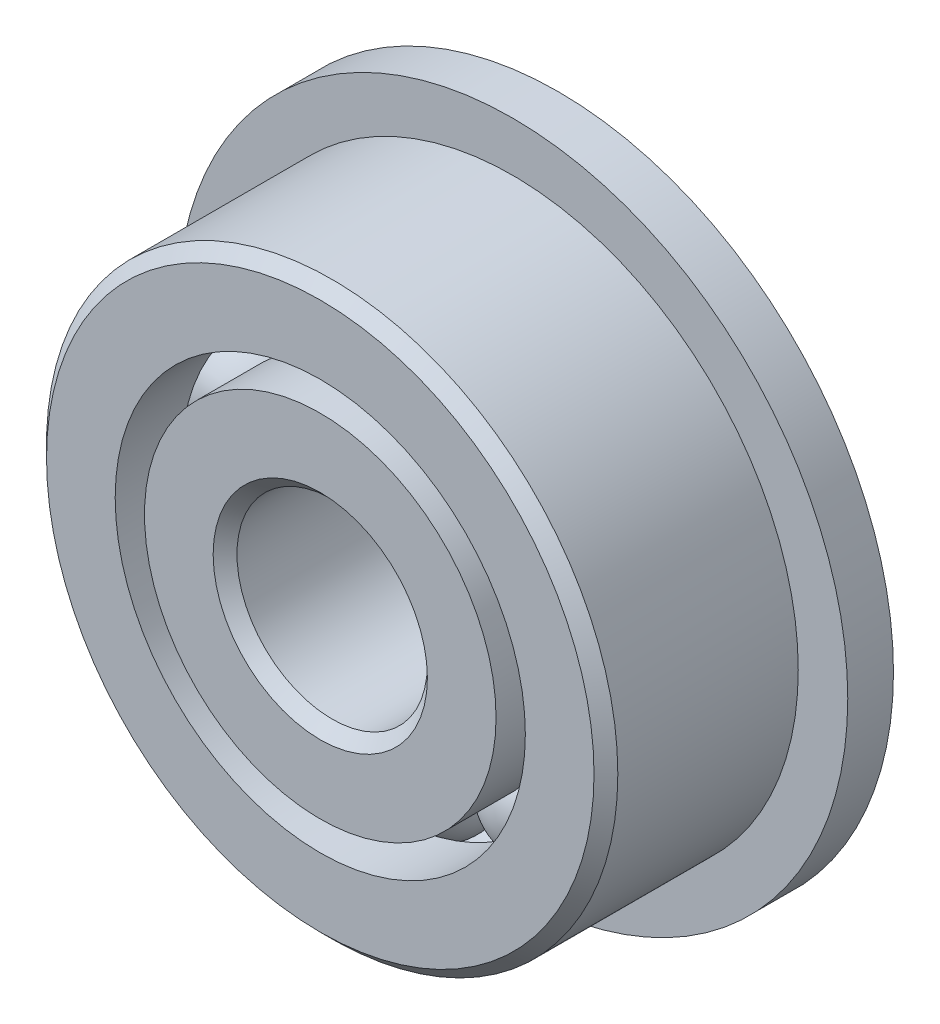
ISO-10303-21;
HEADER;
FILE_DESCRIPTION(('STEP AP214'),'2;1');
FILE_NAME('part.step','',(''),(''),'','','');
FILE_SCHEMA(('AUTOMOTIVE_DESIGN { 1 0 10303 214 1 1 1 1 }'));
ENDSEC;
DATA;
#1=APPLICATION_CONTEXT('core data for automotive mechanical design processes');
#2=APPLICATION_PROTOCOL_DEFINITION('international standard','automotive_design',2000,#1);
#3=PRODUCT_CONTEXT('',#1,'mechanical');
#4=PRODUCT('Part','Part','',(#3));
#5=PRODUCT_RELATED_PRODUCT_CATEGORY('part','',(#4));
#6=PRODUCT_DEFINITION_FORMATION('','',#4);
#7=PRODUCT_DEFINITION_CONTEXT('part definition',#1,'design');
#8=PRODUCT_DEFINITION('design','',#6,#7);
#9=PRODUCT_DEFINITION_SHAPE('','',#8);
#10=(LENGTH_UNIT() NAMED_UNIT(*) SI_UNIT(.MILLI.,.METRE.));
#11=(NAMED_UNIT(*) PLANE_ANGLE_UNIT() SI_UNIT($,.RADIAN.));
#12=(NAMED_UNIT(*) SI_UNIT($,.STERADIAN.) SOLID_ANGLE_UNIT());
#13=UNCERTAINTY_MEASURE_WITH_UNIT(LENGTH_MEASURE(1.E-05),#10,'distance_accuracy_value','');
#14=(GEOMETRIC_REPRESENTATION_CONTEXT(3) GLOBAL_UNCERTAINTY_ASSIGNED_CONTEXT((#13)) GLOBAL_UNIT_ASSIGNED_CONTEXT((#10,
#11,#12)) REPRESENTATION_CONTEXT('',''));
#15=CARTESIAN_POINT('',(0.,0.,0.));
#16=DIRECTION('',(0.,0.,1.));
#17=DIRECTION('',(1.,0.,0.));
#18=AXIS2_PLACEMENT_3D('',#15,#16,#17);
#19=CARTESIAN_POINT('',(-1.86621817602857,2.56862895714048,0.));
#20=DIRECTION('',(0.,0.,1.));
#21=DIRECTION('',(-0.587785252292462,0.809016994374955,0.));
#22=AXIS2_PLACEMENT_3D('',#19,#20,#21);
#23=SPHERICAL_SURFACE('',#22,0.915136422466876);
#24=CARTESIAN_POINT('',(-1.86621817602857,2.56862895714048,0.915136422466876));
#25=VERTEX_POINT('',#24);
#26=VERTEX_LOOP('',#25);
#27=FACE_BOUND('',#26,.T.);
#28=ADVANCED_FACE('F37',(#27),#23,.T.);
#29=CLOSED_SHELL('',(#28));
#30=MANIFOLD_SOLID_BREP('B2',#29);
#31=CARTESIAN_POINT('',(-3.0196044392371,0.981128957140492,0.));
#32=DIRECTION('',(0.,0.,1.));
#33=DIRECTION('',(-0.95105651629515,0.309016994374958,0.));
#34=AXIS2_PLACEMENT_3D('',#31,#32,#33);
#35=SPHERICAL_SURFACE('',#34,0.915136422466876);
#36=CARTESIAN_POINT('',(-3.0196044392371,0.981128957140492,0.915136422466876));
#37=VERTEX_POINT('',#36);
#38=VERTEX_LOOP('',#37);
#39=FACE_BOUND('',#38,.T.);
#40=ADVANCED_FACE('F57',(#39),#35,.T.);
#41=CLOSED_SHELL('',(#40));
#42=MANIFOLD_SOLID_BREP('B6',#41);
#43=CARTESIAN_POINT('',(-3.01960443923712,-0.981128957140429,0.));
#44=DIRECTION('',(0.,0.,1.));
#45=DIRECTION('',(-0.951056516295157,-0.309016994374938,0.));
#46=AXIS2_PLACEMENT_3D('',#43,#44,#45);
#47=SPHERICAL_SURFACE('',#46,0.915136422466876);
#48=CARTESIAN_POINT('',(-3.01960443923712,-0.981128957140429,0.915136422466876));
#49=VERTEX_POINT('',#48);
#50=VERTEX_LOOP('',#49);
#51=FACE_BOUND('',#50,.T.);
#52=ADVANCED_FACE('F77',(#51),#47,.T.);
#53=CLOSED_SHELL('',(#52));
#54=MANIFOLD_SOLID_BREP('B33',#53);
#55=CARTESIAN_POINT('',(-1.86621817602862,-2.56862895714044,0.));
#56=DIRECTION('',(0.,0.,1.));
#57=DIRECTION('',(-0.58778525229248,-0.809016994374942,0.));
#58=AXIS2_PLACEMENT_3D('',#55,#56,#57);
#59=SPHERICAL_SURFACE('',#58,0.915136422466876);
#60=CARTESIAN_POINT('',(-1.86621817602862,-2.56862895714044,0.915136422466876));
#61=VERTEX_POINT('',#60);
#62=VERTEX_LOOP('',#61);
#63=FACE_BOUND('',#62,.T.);
#64=ADVANCED_FACE('F97',(#63),#59,.T.);
#65=CLOSED_SHELL('',(#64));
#66=MANIFOLD_SOLID_BREP('B53',#65);
#67=CARTESIAN_POINT('',(0.,-3.175,0.));
#68=DIRECTION('',(0.,0.,1.));
#69=DIRECTION('',(0.,-1.,0.));
#70=AXIS2_PLACEMENT_3D('',#67,#68,#69);
#71=SPHERICAL_SURFACE('',#70,0.915136422466876);
#72=CARTESIAN_POINT('',(0.,-3.175,0.915136422466876));
#73=VERTEX_POINT('',#72);
#74=VERTEX_LOOP('',#73);
#75=FACE_BOUND('',#74,.T.);
#76=ADVANCED_FACE('F117',(#75),#71,.T.);
#77=CLOSED_SHELL('',(#76));
#78=MANIFOLD_SOLID_BREP('B73',#77);
#79=CARTESIAN_POINT('',(1.86621817602859,-2.56862895714047,0.));
#80=DIRECTION('',(0.,0.,1.));
#81=DIRECTION('',(0.587785252292469,-0.809016994374951,0.));
#82=AXIS2_PLACEMENT_3D('',#79,#80,#81);
#83=SPHERICAL_SURFACE('',#82,0.915136422466876);
#84=CARTESIAN_POINT('',(1.86621817602859,-2.56862895714047,0.915136422466876));
#85=VERTEX_POINT('',#84);
#86=VERTEX_LOOP('',#85);
#87=FACE_BOUND('',#86,.T.);
#88=ADVANCED_FACE('F137',(#87),#83,.T.);
#89=CLOSED_SHELL('',(#88));
#90=MANIFOLD_SOLID_BREP('B93',#89);
#91=CARTESIAN_POINT('',(3.01960443923711,-0.981128957140471,0.));
#92=DIRECTION('',(0.,0.,1.));
#93=DIRECTION('',(0.951056516295152,-0.309016994374952,0.));
#94=AXIS2_PLACEMENT_3D('',#91,#92,#93);
#95=SPHERICAL_SURFACE('',#94,0.915136422466876);
#96=CARTESIAN_POINT('',(3.01960443923711,-0.981128957140471,0.915136422466876));
#97=VERTEX_POINT('',#96);
#98=VERTEX_LOOP('',#97);
#99=FACE_BOUND('',#98,.T.);
#100=ADVANCED_FACE('F157',(#99),#95,.T.);
#101=CLOSED_SHELL('',(#100));
#102=MANIFOLD_SOLID_BREP('B113',#101);
#103=CARTESIAN_POINT('',(3.01960443923712,0.98112895714045,0.));
#104=DIRECTION('',(0.,0.,1.));
#105=DIRECTION('',(0.951056516295155,0.309016994374945,0.));
#106=AXIS2_PLACEMENT_3D('',#103,#104,#105);
#107=SPHERICAL_SURFACE('',#106,0.915136422466876);
#108=CARTESIAN_POINT('',(3.01960443923712,0.98112895714045,0.915136422466876));
#109=VERTEX_POINT('',#108);
#110=VERTEX_LOOP('',#109);
#111=FACE_BOUND('',#110,.T.);
#112=ADVANCED_FACE('F177',(#111),#107,.T.);
#113=CLOSED_SHELL('',(#112));
#114=MANIFOLD_SOLID_BREP('B133',#113);
#115=CARTESIAN_POINT('',(1.86621817602861,2.56862895714046,0.));
#116=DIRECTION('',(0.,0.,1.));
#117=DIRECTION('',(0.587785252292474,0.809016994374947,0.));
#118=AXIS2_PLACEMENT_3D('',#115,#116,#117);
#119=SPHERICAL_SURFACE('',#118,0.915136422466876);
#120=CARTESIAN_POINT('',(1.86621817602861,2.56862895714046,0.915136422466876));
#121=VERTEX_POINT('',#120);
#122=VERTEX_LOOP('',#121);
#123=FACE_BOUND('',#122,.T.);
#124=ADVANCED_FACE('F197',(#123),#119,.T.);
#125=CLOSED_SHELL('',(#124));
#126=MANIFOLD_SOLID_BREP('B153',#125);
#127=CARTESIAN_POINT('',(0.,3.175,0.));
#128=DIRECTION('',(0.,0.,1.));
#129=DIRECTION('',(0.,1.,0.));
#130=AXIS2_PLACEMENT_3D('',#127,#128,#129);
#131=SPHERICAL_SURFACE('',#130,0.915136422466876);
#132=CARTESIAN_POINT('',(0.,3.175,0.915136422466876));
#133=VERTEX_POINT('',#132);
#134=VERTEX_LOOP('',#133);
#135=FACE_BOUND('',#134,.T.);
#136=ADVANCED_FACE('F219',(#135),#131,.T.);
#137=CLOSED_SHELL('',(#136));
#138=MANIFOLD_SOLID_BREP('B173',#137);
#139=CARTESIAN_POINT('',(0.,2.93076923076923,1.984375));
#140=DIRECTION('',(0.,0.,-1.));
#141=DIRECTION('',(-1.,0.,0.));
#142=AXIS2_PLACEMENT_3D('',#139,#140,#141);
#143=PLANE('',#142);
#144=CARTESIAN_POINT('',(0.,0.,1.984375));
#145=DIRECTION('',(0.,0.,1.));
#146=DIRECTION('',(1.,0.,0.));
#147=AXIS2_PLACEMENT_3D('',#144,#145,#146);
#148=CIRCLE('',#147,1.7859375);
#149=CARTESIAN_POINT('',(1.7859375,0.,1.984375));
#150=VERTEX_POINT('',#149);
#151=EDGE_CURVE('E266',#150,#150,#148,.T.);
#152=ORIENTED_EDGE('',*,*,#151,.F.);
#153=EDGE_LOOP('',(#152));
#154=FACE_BOUND('',#153,.T.);
#155=CARTESIAN_POINT('',(0.,0.,1.984375));
#156=DIRECTION('',(0.,0.,1.));
#157=DIRECTION('',(1.,0.,0.));
#158=AXIS2_PLACEMENT_3D('',#155,#156,#157);
#159=CIRCLE('',#158,2.93076923076923);
#160=CARTESIAN_POINT('',(2.93076923076923,0.,1.984375));
#161=VERTEX_POINT('',#160);
#162=EDGE_CURVE('E218',#161,#161,#159,.T.);
#163=ORIENTED_EDGE('',*,*,#162,.T.);
#164=EDGE_LOOP('',(#163));
#165=FACE_BOUND('',#164,.T.);
#166=ADVANCED_FACE('F238',(#154,#165),#143,.F.);
#167=CARTESIAN_POINT('',(0.,0.,1.984375));
#168=DIRECTION('',(0.,0.,1.));
#169=DIRECTION('',(1.,0.,0.));
#170=AXIS2_PLACEMENT_3D('',#167,#168,#169);
#171=CYLINDRICAL_SURFACE('',#170,2.93076923076923);
#172=ORIENTED_EDGE('',*,*,#162,.F.);
#173=EDGE_LOOP('',(#172));
#174=FACE_BOUND('',#173,.T.);
#175=CARTESIAN_POINT('',(0.,0.,0.881944444444444));
#176=DIRECTION('',(0.,0.,1.));
#177=DIRECTION('',(1.,0.,0.));
#178=AXIS2_PLACEMENT_3D('',#175,#176,#177);
#179=CIRCLE('',#178,2.93076923076923);
#180=CARTESIAN_POINT('',(2.93076923076923,0.,0.881944444444444));
#181=VERTEX_POINT('',#180);
#182=EDGE_CURVE('E244',#181,#181,#179,.T.);
#183=ORIENTED_EDGE('',*,*,#182,.T.);
#184=EDGE_LOOP('',(#183));
#185=FACE_BOUND('',#184,.T.);
#186=ADVANCED_FACE('F273',(#174,#185),#171,.T.);
#187=CARTESIAN_POINT('',(0.,0.,0.));
#188=DIRECTION('',(0.,0.,1.));
#189=DIRECTION('',(1.,0.,0.));
#190=AXIS2_PLACEMENT_3D('',#187,#188,#189);
#191=TOROIDAL_SURFACE('',#190,3.175,0.915136422466875);
#192=ORIENTED_EDGE('',*,*,#182,.F.);
#193=EDGE_LOOP('',(#192));
#194=FACE_BOUND('',#193,.T.);
#195=CARTESIAN_POINT('',(0.,0.,-0.881944444444445));
#196=DIRECTION('',(0.,0.,1.));
#197=DIRECTION('',(1.,0.,0.));
#198=AXIS2_PLACEMENT_3D('',#195,#196,#197);
#199=CIRCLE('',#198,2.93076923076923);
#200=CARTESIAN_POINT('',(2.93076923076923,0.,-0.881944444444445));
#201=VERTEX_POINT('',#200);
#202=EDGE_CURVE('E248',#201,#201,#199,.T.);
#203=ORIENTED_EDGE('',*,*,#202,.T.);
#204=EDGE_LOOP('',(#203));
#205=FACE_BOUND('',#204,.T.);
#206=ADVANCED_FACE('F277',(#194,#205),#191,.F.);
#207=CARTESIAN_POINT('',(0.,0.,1.984375));
#208=DIRECTION('',(0.,0.,1.));
#209=DIRECTION('',(1.,0.,0.));
#210=AXIS2_PLACEMENT_3D('',#207,#208,#209);
#211=CYLINDRICAL_SURFACE('',#210,2.93076923076923);
#212=ORIENTED_EDGE('',*,*,#202,.F.);
#213=EDGE_LOOP('',(#212));
#214=FACE_BOUND('',#213,.T.);
#215=CARTESIAN_POINT('',(0.,0.,-1.984375));
#216=DIRECTION('',(0.,0.,1.));
#217=DIRECTION('',(1.,0.,0.));
#218=AXIS2_PLACEMENT_3D('',#215,#216,#217);
#219=CIRCLE('',#218,2.93076923076923);
#220=CARTESIAN_POINT('',(2.93076923076923,0.,-1.984375));
#221=VERTEX_POINT('',#220);
#222=EDGE_CURVE('E252',#221,#221,#219,.T.);
#223=ORIENTED_EDGE('',*,*,#222,.T.);
#224=EDGE_LOOP('',(#223));
#225=FACE_BOUND('',#224,.T.);
#226=ADVANCED_FACE('F282',(#214,#225),#211,.T.);
#227=CARTESIAN_POINT('',(0.,1.7859375,-1.984375));
#228=DIRECTION('',(0.,0.,1.));
#229=DIRECTION('',(1.,0.,0.));
#230=AXIS2_PLACEMENT_3D('',#227,#228,#229);
#231=PLANE('',#230);
#232=ORIENTED_EDGE('',*,*,#222,.F.);
#233=EDGE_LOOP('',(#232));
#234=FACE_BOUND('',#233,.T.);
#235=CARTESIAN_POINT('',(0.,0.,-1.984375));
#236=DIRECTION('',(0.,0.,1.));
#237=DIRECTION('',(1.,0.,0.));
#238=AXIS2_PLACEMENT_3D('',#235,#236,#237);
#239=CIRCLE('',#238,1.7859375);
#240=CARTESIAN_POINT('',(1.7859375,0.,-1.984375));
#241=VERTEX_POINT('',#240);
#242=EDGE_CURVE('E257',#241,#241,#239,.T.);
#243=ORIENTED_EDGE('',*,*,#242,.T.);
#244=EDGE_LOOP('',(#243));
#245=FACE_BOUND('',#244,.T.);
#246=ADVANCED_FACE('F288',(#234,#245),#231,.F.);
#247=CARTESIAN_POINT('',(0.,0.,-1.7859375));
#248=DIRECTION('',(0.,0.,-1.));
#249=DIRECTION('',(-1.,0.,0.));
#250=AXIS2_PLACEMENT_3D('',#247,#248,#249);
#251=CONICAL_SURFACE('',#250,1.5875,0.785398163397447);
#252=ORIENTED_EDGE('',*,*,#242,.F.);
#253=EDGE_LOOP('',(#252));
#254=FACE_BOUND('',#253,.T.);
#255=CARTESIAN_POINT('',(0.,0.,-1.7859375));
#256=DIRECTION('',(0.,0.,1.));
#257=DIRECTION('',(1.,0.,0.));
#258=AXIS2_PLACEMENT_3D('',#255,#256,#257);
#259=CIRCLE('',#258,1.5875);
#260=CARTESIAN_POINT('',(1.5875,0.,-1.7859375));
#261=VERTEX_POINT('',#260);
#262=EDGE_CURVE('E260',#261,#261,#259,.T.);
#263=ORIENTED_EDGE('',*,*,#262,.T.);
#264=EDGE_LOOP('',(#263));
#265=FACE_BOUND('',#264,.T.);
#266=ADVANCED_FACE('F292',(#254,#265),#251,.F.);
#267=CARTESIAN_POINT('',(0.,0.,1.984375));
#268=DIRECTION('',(0.,0.,1.));
#269=DIRECTION('',(1.,0.,0.));
#270=AXIS2_PLACEMENT_3D('',#267,#268,#269);
#271=CYLINDRICAL_SURFACE('',#270,1.5875);
#272=ORIENTED_EDGE('',*,*,#262,.F.);
#273=EDGE_LOOP('',(#272));
#274=FACE_BOUND('',#273,.T.);
#275=CARTESIAN_POINT('',(0.,0.,1.7859375));
#276=DIRECTION('',(0.,0.,1.));
#277=DIRECTION('',(1.,0.,0.));
#278=AXIS2_PLACEMENT_3D('',#275,#276,#277);
#279=CIRCLE('',#278,1.5875);
#280=CARTESIAN_POINT('',(1.5875,0.,1.7859375));
#281=VERTEX_POINT('',#280);
#282=EDGE_CURVE('E263',#281,#281,#279,.T.);
#283=ORIENTED_EDGE('',*,*,#282,.T.);
#284=EDGE_LOOP('',(#283));
#285=FACE_BOUND('',#284,.T.);
#286=ADVANCED_FACE('F296',(#274,#285),#271,.F.);
#287=CARTESIAN_POINT('',(0.,0.,1.984375));
#288=DIRECTION('',(0.,0.,1.));
#289=DIRECTION('',(1.,0.,0.));
#290=AXIS2_PLACEMENT_3D('',#287,#288,#289);
#291=CONICAL_SURFACE('',#290,1.7859375,0.785398163397449);
#292=ORIENTED_EDGE('',*,*,#282,.F.);
#293=EDGE_LOOP('',(#292));
#294=FACE_BOUND('',#293,.T.);
#295=ORIENTED_EDGE('',*,*,#151,.T.);
#296=EDGE_LOOP('',(#295));
#297=FACE_BOUND('',#296,.T.);
#298=ADVANCED_FACE('F270',(#294,#297),#291,.F.);
#299=CLOSED_SHELL('',(#166,#186,#206,#226,#246,#266,#286,#298));
#300=MANIFOLD_SOLID_BREP('B193',#299);
#301=CARTESIAN_POINT('',(0.,0.,1.7859375));
#302=DIRECTION('',(0.,0.,-1.));
#303=DIRECTION('',(-1.,0.,0.));
#304=AXIS2_PLACEMENT_3D('',#301,#302,#303);
#305=CONICAL_SURFACE('',#304,4.7625,0.785398163397448);
#306=CARTESIAN_POINT('',(0.,0.,1.984375));
#307=DIRECTION('',(0.,0.,1.));
#308=DIRECTION('',(1.,0.,0.));
#309=AXIS2_PLACEMENT_3D('',#306,#307,#308);
#310=CIRCLE('',#309,4.5640625);
#311=CARTESIAN_POINT('',(4.5640625,0.,1.984375));
#312=VERTEX_POINT('',#311);
#313=EDGE_CURVE('E381',#312,#312,#310,.T.);
#314=ORIENTED_EDGE('',*,*,#313,.F.);
#315=EDGE_LOOP('',(#314));
#316=FACE_BOUND('',#315,.T.);
#317=CARTESIAN_POINT('',(0.,0.,1.7859375));
#318=DIRECTION('',(0.,0.,1.));
#319=DIRECTION('',(1.,0.,0.));
#320=AXIS2_PLACEMENT_3D('',#317,#318,#319);
#321=CIRCLE('',#320,4.7625);
#322=CARTESIAN_POINT('',(4.7625,0.,1.7859375));
#323=VERTEX_POINT('',#322);
#324=EDGE_CURVE('E237',#323,#323,#321,.T.);
#325=ORIENTED_EDGE('',*,*,#324,.T.);
#326=EDGE_LOOP('',(#325));
#327=FACE_BOUND('',#326,.T.);
#328=ADVANCED_FACE('F359',(#316,#327),#305,.T.);
#329=CARTESIAN_POINT('',(0.,0.,1.984375));
#330=DIRECTION('',(0.,0.,1.));
#331=DIRECTION('',(1.,0.,0.));
#332=AXIS2_PLACEMENT_3D('',#329,#330,#331);
#333=CYLINDRICAL_SURFACE('',#332,4.7625);
#334=CARTESIAN_POINT('',(0.,0.,-1.222375));
#335=DIRECTION('',(0.,0.,1.));
#336=DIRECTION('',(1.,0.,0.));
#337=AXIS2_PLACEMENT_3D('',#334,#335,#336);
#338=CIRCLE('',#337,4.7625);
#339=CARTESIAN_POINT('',(4.7625,0.,-1.222375));
#340=VERTEX_POINT('',#339);
#341=EDGE_CURVE('E384',#340,#340,#338,.T.);
#342=ORIENTED_EDGE('',*,*,#341,.T.);
#343=EDGE_LOOP('',(#342));
#344=FACE_BOUND('',#343,.T.);
#345=ORIENTED_EDGE('',*,*,#324,.F.);
#346=EDGE_LOOP('',(#345));
#347=FACE_BOUND('',#346,.T.);
#348=ADVANCED_FACE('F404',(#344,#347),#333,.T.);
#349=CARTESIAN_POINT('',(0.,4.5640625,-1.984375));
#350=DIRECTION('',(0.,0.,1.));
#351=DIRECTION('',(1.,0.,0.));
#352=AXIS2_PLACEMENT_3D('',#349,#350,#351);
#353=PLANE('',#352);
#354=CARTESIAN_POINT('',(0.,0.,-1.984375));
#355=DIRECTION('',(0.,0.,1.));
#356=DIRECTION('',(1.,0.,0.));
#357=AXIS2_PLACEMENT_3D('',#354,#355,#356);
#358=CIRCLE('',#357,3.41923076923077);
#359=CARTESIAN_POINT('',(3.41923076923077,0.,-1.984375));
#360=VERTEX_POINT('',#359);
#361=EDGE_CURVE('E365',#360,#360,#358,.T.);
#362=ORIENTED_EDGE('',*,*,#361,.T.);
#363=EDGE_LOOP('',(#362));
#364=FACE_BOUND('',#363,.T.);
#365=CARTESIAN_POINT('',(0.,0.,-1.984375));
#366=DIRECTION('',(0.,0.,-1.));
#367=DIRECTION('',(-1.,0.,0.));
#368=AXIS2_PLACEMENT_3D('',#365,#366,#367);
#369=CIRCLE('',#368,5.588);
#370=CARTESIAN_POINT('',(-5.588,0.,-1.984375));
#371=VERTEX_POINT('',#370);
#372=EDGE_CURVE('E387',#371,#371,#369,.T.);
#373=ORIENTED_EDGE('',*,*,#372,.T.);
#374=EDGE_LOOP('',(#373));
#375=FACE_BOUND('',#374,.T.);
#376=ADVANCED_FACE('F407',(#364,#375),#353,.F.);
#377=CARTESIAN_POINT('',(0.,0.,1.984375));
#378=DIRECTION('',(0.,0.,1.));
#379=DIRECTION('',(1.,0.,0.));
#380=AXIS2_PLACEMENT_3D('',#377,#378,#379);
#381=CYLINDRICAL_SURFACE('',#380,3.41923076923077);
#382=CARTESIAN_POINT('',(0.,0.,-0.881944444444445));
#383=DIRECTION('',(0.,0.,1.));
#384=DIRECTION('',(1.,0.,0.));
#385=AXIS2_PLACEMENT_3D('',#382,#383,#384);
#386=CIRCLE('',#385,3.41923076923077);
#387=CARTESIAN_POINT('',(3.41923076923077,0.,-0.881944444444445));
#388=VERTEX_POINT('',#387);
#389=EDGE_CURVE('E369',#388,#388,#386,.T.);
#390=ORIENTED_EDGE('',*,*,#389,.T.);
#391=EDGE_LOOP('',(#390));
#392=FACE_BOUND('',#391,.T.);
#393=ORIENTED_EDGE('',*,*,#361,.F.);
#394=EDGE_LOOP('',(#393));
#395=FACE_BOUND('',#394,.T.);
#396=ADVANCED_FACE('F412',(#392,#395),#381,.F.);
#397=CARTESIAN_POINT('',(0.,0.,0.));
#398=DIRECTION('',(0.,0.,1.));
#399=DIRECTION('',(1.,0.,0.));
#400=AXIS2_PLACEMENT_3D('',#397,#398,#399);
#401=TOROIDAL_SURFACE('',#400,3.175,0.915136422466876);
#402=ORIENTED_EDGE('',*,*,#389,.F.);
#403=EDGE_LOOP('',(#402));
#404=FACE_BOUND('',#403,.T.);
#405=CARTESIAN_POINT('',(0.,0.,0.881944444444444));
#406=DIRECTION('',(0.,0.,1.));
#407=DIRECTION('',(1.,0.,0.));
#408=AXIS2_PLACEMENT_3D('',#405,#406,#407);
#409=CIRCLE('',#408,3.41923076923077);
#410=CARTESIAN_POINT('',(3.41923076923077,0.,0.881944444444444));
#411=VERTEX_POINT('',#410);
#412=EDGE_CURVE('E373',#411,#411,#409,.T.);
#413=ORIENTED_EDGE('',*,*,#412,.T.);
#414=EDGE_LOOP('',(#413));
#415=FACE_BOUND('',#414,.T.);
#416=ADVANCED_FACE('F418',(#404,#415),#401,.F.);
#417=CARTESIAN_POINT('',(0.,0.,1.984375));
#418=DIRECTION('',(0.,0.,1.));
#419=DIRECTION('',(1.,0.,0.));
#420=AXIS2_PLACEMENT_3D('',#417,#418,#419);
#421=CYLINDRICAL_SURFACE('',#420,3.41923076923077);
#422=ORIENTED_EDGE('',*,*,#412,.F.);
#423=EDGE_LOOP('',(#422));
#424=FACE_BOUND('',#423,.T.);
#425=CARTESIAN_POINT('',(0.,0.,1.984375));
#426=DIRECTION('',(0.,0.,1.));
#427=DIRECTION('',(1.,0.,0.));
#428=AXIS2_PLACEMENT_3D('',#425,#426,#427);
#429=CIRCLE('',#428,3.41923076923077);
#430=CARTESIAN_POINT('',(3.41923076923077,0.,1.984375));
#431=VERTEX_POINT('',#430);
#432=EDGE_CURVE('E378',#431,#431,#429,.T.);
#433=ORIENTED_EDGE('',*,*,#432,.T.);
#434=EDGE_LOOP('',(#433));
#435=FACE_BOUND('',#434,.T.);
#436=ADVANCED_FACE('F422',(#424,#435),#421,.F.);
#437=CARTESIAN_POINT('',(0.,4.5640625,1.984375));
#438=DIRECTION('',(0.,0.,-1.));
#439=DIRECTION('',(-1.,0.,0.));
#440=AXIS2_PLACEMENT_3D('',#437,#438,#439);
#441=PLANE('',#440);
#442=ORIENTED_EDGE('',*,*,#432,.F.);
#443=EDGE_LOOP('',(#442));
#444=FACE_BOUND('',#443,.T.);
#445=ORIENTED_EDGE('',*,*,#313,.T.);
#446=EDGE_LOOP('',(#445));
#447=FACE_BOUND('',#446,.T.);
#448=ADVANCED_FACE('F400',(#444,#447),#441,.F.);
#449=CARTESIAN_POINT('',(0.,3.41923076923077,-1.222375));
#450=DIRECTION('',(0.,0.,1.));
#451=DIRECTION('',(1.,0.,0.));
#452=AXIS2_PLACEMENT_3D('',#449,#450,#451);
#453=PLANE('',#452);
#454=CARTESIAN_POINT('',(0.,0.,-1.222375));
#455=DIRECTION('',(0.,0.,-1.));
#456=DIRECTION('',(-1.,0.,0.));
#457=AXIS2_PLACEMENT_3D('',#454,#455,#456);
#458=CIRCLE('',#457,5.588);
#459=CARTESIAN_POINT('',(-5.588,0.,-1.222375));
#460=VERTEX_POINT('',#459);
#461=EDGE_CURVE('E390',#460,#460,#458,.T.);
#462=ORIENTED_EDGE('',*,*,#461,.F.);
#463=EDGE_LOOP('',(#462));
#464=FACE_BOUND('',#463,.T.);
#465=ORIENTED_EDGE('',*,*,#341,.F.);
#466=EDGE_LOOP('',(#465));
#467=FACE_BOUND('',#466,.T.);
#468=ADVANCED_FACE('F397',(#464,#467),#453,.T.);
#469=CARTESIAN_POINT('',(0.,0.,-1.984375));
#470=DIRECTION('',(0.,0.,-1.));
#471=DIRECTION('',(-1.,0.,0.));
#472=AXIS2_PLACEMENT_3D('',#469,#470,#471);
#473=CYLINDRICAL_SURFACE('',#472,5.588);
#474=ORIENTED_EDGE('',*,*,#461,.T.);
#475=EDGE_LOOP('',(#474));
#476=FACE_BOUND('',#475,.T.);
#477=ORIENTED_EDGE('',*,*,#372,.F.);
#478=EDGE_LOOP('',(#477));
#479=FACE_BOUND('',#478,.T.);
#480=ADVANCED_FACE('F394',(#476,#479),#473,.T.);
#481=CLOSED_SHELL('',(#328,#348,#376,#396,#416,#436,#448,#468,#480));
#482=MANIFOLD_SOLID_BREP('B213',#481);
#483=ADVANCED_BREP_SHAPE_REPRESENTATION('',(#18,#30,#42,#54,#66,#78,#90,#102,#114,#126,#138,
#300,#482),#14);
#484=SHAPE_DEFINITION_REPRESENTATION(#9,#483);
ENDSEC;
END-ISO-10303-21;
